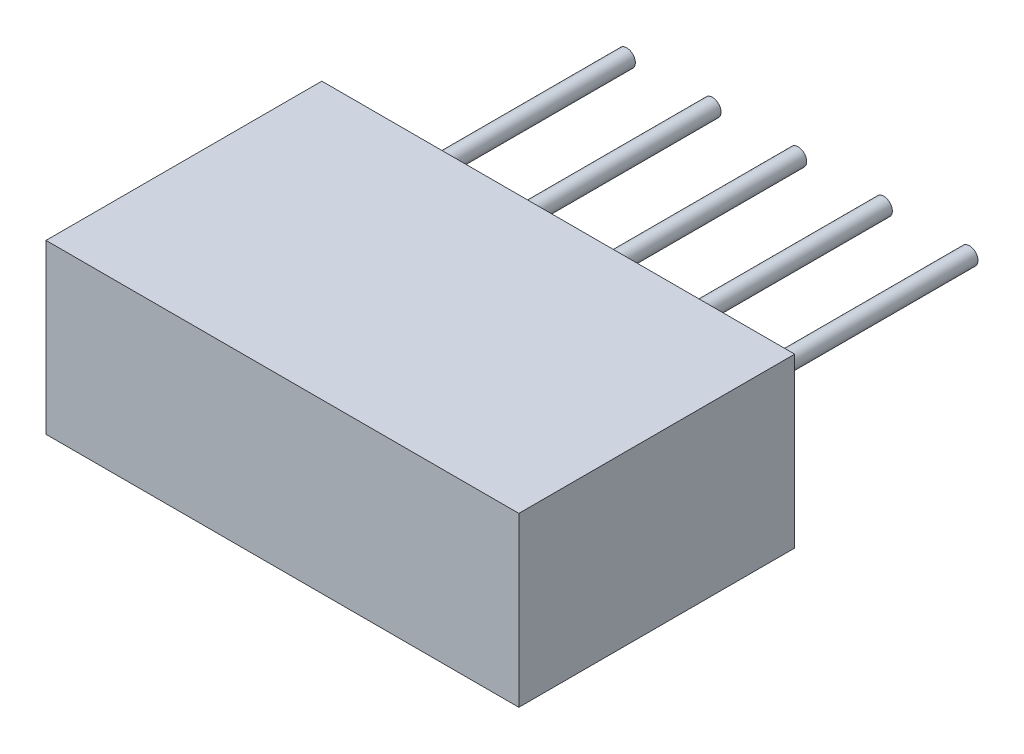
ISO-10303-21;
HEADER;
FILE_DESCRIPTION(('STEP AP214'),'2;1');
FILE_NAME('part.step','',(''),(''),'','','');
FILE_SCHEMA(('AUTOMOTIVE_DESIGN { 1 0 10303 214 1 1 1 1 }'));
ENDSEC;
DATA;
#1=APPLICATION_CONTEXT('core data for automotive mechanical design processes');
#2=APPLICATION_PROTOCOL_DEFINITION('international standard','automotive_design',2000,#1);
#3=PRODUCT_CONTEXT('',#1,'mechanical');
#4=PRODUCT('Part','Part','',(#3));
#5=PRODUCT_RELATED_PRODUCT_CATEGORY('part','',(#4));
#6=PRODUCT_DEFINITION_FORMATION('','',#4);
#7=PRODUCT_DEFINITION_CONTEXT('part definition',#1,'design');
#8=PRODUCT_DEFINITION('design','',#6,#7);
#9=PRODUCT_DEFINITION_SHAPE('','',#8);
#10=(LENGTH_UNIT() NAMED_UNIT(*) SI_UNIT(.MILLI.,.METRE.));
#11=(NAMED_UNIT(*) PLANE_ANGLE_UNIT() SI_UNIT($,.RADIAN.));
#12=(NAMED_UNIT(*) SI_UNIT($,.STERADIAN.) SOLID_ANGLE_UNIT());
#13=UNCERTAINTY_MEASURE_WITH_UNIT(LENGTH_MEASURE(1.E-05),#10,'distance_accuracy_value','');
#14=(GEOMETRIC_REPRESENTATION_CONTEXT(3) GLOBAL_UNCERTAINTY_ASSIGNED_CONTEXT((#13)) GLOBAL_UNIT_ASSIGNED_CONTEXT((#10,
#11,#12)) REPRESENTATION_CONTEXT('',''));
#15=CARTESIAN_POINT('',(0.,0.,0.));
#16=DIRECTION('',(0.,0.,1.));
#17=DIRECTION('',(1.,0.,0.));
#18=AXIS2_PLACEMENT_3D('',#15,#16,#17);
#19=CARTESIAN_POINT('',(0.,0.25,0.));
#20=DIRECTION('',(0.,0.,1.));
#21=DIRECTION('',(1.,0.,0.));
#22=AXIS2_PLACEMENT_3D('',#19,#20,#21);
#23=PLANE('',#22);
#24=CARTESIAN_POINT('',(0.,0.25,0.));
#25=DIRECTION('',(0.,0.,1.));
#26=DIRECTION('',(1.,0.,0.));
#27=AXIS2_PLACEMENT_3D('',#24,#25,#26);
#28=CIRCLE('',#27,0.127);
#29=CARTESIAN_POINT('',(-0.127,0.25,0.));
#30=VERTEX_POINT('',#29);
#31=EDGE_CURVE('P0_E18',#30,#30,#28,.T.);
#32=ORIENTED_EDGE('',*,*,#31,.T.);
#33=EDGE_LOOP('',(#32));
#34=FACE_BOUND('',#33,.T.);
#35=ADVANCED_FACE('P0_F15',(#34),#23,.T.);
#36=CARTESIAN_POINT('',(0.,0.25,-3.556));
#37=DIRECTION('',(0.,0.,1.));
#38=DIRECTION('',(1.,0.,0.));
#39=AXIS2_PLACEMENT_3D('',#36,#37,#38);
#40=PLANE('',#39);
#41=CARTESIAN_POINT('',(0.,0.25,-3.556));
#42=DIRECTION('',(0.,0.,-1.));
#43=DIRECTION('',(1.,0.,0.));
#44=AXIS2_PLACEMENT_3D('',#41,#42,#43);
#45=CIRCLE('',#44,0.127);
#46=CARTESIAN_POINT('',(-0.127,0.25,-3.556));
#47=VERTEX_POINT('',#46);
#48=EDGE_CURVE('P0_E10',#47,#47,#45,.T.);
#49=ORIENTED_EDGE('',*,*,#48,.T.);
#50=EDGE_LOOP('',(#49));
#51=FACE_BOUND('',#50,.T.);
#52=ADVANCED_FACE('P0_F50',(#51),#40,.F.);
#53=CARTESIAN_POINT('',(0.,0.25,-3.556));
#54=DIRECTION('',(0.,0.,1.));
#55=DIRECTION('',(1.,0.,0.));
#56=AXIS2_PLACEMENT_3D('',#53,#54,#55);
#57=CYLINDRICAL_SURFACE('',#56,0.127);
#58=ORIENTED_EDGE('',*,*,#48,.F.);
#59=EDGE_LOOP('',(#58));
#60=FACE_BOUND('',#59,.T.);
#61=ORIENTED_EDGE('',*,*,#31,.F.);
#62=EDGE_LOOP('',(#61));
#63=FACE_BOUND('',#62,.T.);
#64=ADVANCED_FACE('P0_F44',(#60,#63),#57,.T.);
#65=CLOSED_SHELL('',(#35,#52,#64));
#66=MANIFOLD_SOLID_BREP('P0_B1',#65);
#67=CARTESIAN_POINT('',(1.27,0.25,0.));
#68=DIRECTION('',(0.,0.,1.));
#69=DIRECTION('',(1.,0.,0.));
#70=AXIS2_PLACEMENT_3D('',#67,#68,#69);
#71=PLANE('',#70);
#72=CARTESIAN_POINT('',(1.27,0.25,0.));
#73=DIRECTION('',(0.,0.,1.));
#74=DIRECTION('',(1.,0.,0.));
#75=AXIS2_PLACEMENT_3D('',#72,#73,#74);
#76=CIRCLE('',#75,0.127);
#77=CARTESIAN_POINT('',(1.143,0.25,0.));
#78=VERTEX_POINT('',#77);
#79=EDGE_CURVE('P1_E25',#78,#78,#76,.T.);
#80=ORIENTED_EDGE('',*,*,#79,.T.);
#81=EDGE_LOOP('',(#80));
#82=FACE_BOUND('',#81,.T.);
#83=ADVANCED_FACE('P1_F16',(#82),#71,.T.);
#84=CARTESIAN_POINT('',(1.27,0.25,-3.556));
#85=DIRECTION('',(0.,0.,1.));
#86=DIRECTION('',(1.,0.,0.));
#87=AXIS2_PLACEMENT_3D('',#84,#85,#86);
#88=PLANE('',#87);
#89=CARTESIAN_POINT('',(1.27,0.25,-3.556));
#90=DIRECTION('',(0.,0.,-1.));
#91=DIRECTION('',(1.,0.,0.));
#92=AXIS2_PLACEMENT_3D('',#89,#90,#91);
#93=CIRCLE('',#92,0.127);
#94=CARTESIAN_POINT('',(1.143,0.25,-3.556));
#95=VERTEX_POINT('',#94);
#96=EDGE_CURVE('P1_E11',#95,#95,#93,.T.);
#97=ORIENTED_EDGE('',*,*,#96,.T.);
#98=EDGE_LOOP('',(#97));
#99=FACE_BOUND('',#98,.T.);
#100=ADVANCED_FACE('P1_F46',(#99),#88,.F.);
#101=CARTESIAN_POINT('',(1.27,0.25,-3.556));
#102=DIRECTION('',(0.,0.,1.));
#103=DIRECTION('',(1.,0.,0.));
#104=AXIS2_PLACEMENT_3D('',#101,#102,#103);
#105=CYLINDRICAL_SURFACE('',#104,0.127);
#106=ORIENTED_EDGE('',*,*,#96,.F.);
#107=EDGE_LOOP('',(#106));
#108=FACE_BOUND('',#107,.T.);
#109=ORIENTED_EDGE('',*,*,#79,.F.);
#110=EDGE_LOOP('',(#109));
#111=FACE_BOUND('',#110,.T.);
#112=ADVANCED_FACE('P1_F18',(#108,#111),#105,.T.);
#113=CLOSED_SHELL('',(#83,#100,#112));
#114=MANIFOLD_SOLID_BREP('P1_B1',#113);
#115=CARTESIAN_POINT('',(2.54,0.25,0.));
#116=DIRECTION('',(0.,0.,1.));
#117=DIRECTION('',(1.,0.,0.));
#118=AXIS2_PLACEMENT_3D('',#115,#116,#117);
#119=PLANE('',#118);
#120=CARTESIAN_POINT('',(2.54,0.25,0.));
#121=DIRECTION('',(0.,0.,1.));
#122=DIRECTION('',(1.,0.,0.));
#123=AXIS2_PLACEMENT_3D('',#120,#121,#122);
#124=CIRCLE('',#123,0.127);
#125=CARTESIAN_POINT('',(2.413,0.25,0.));
#126=VERTEX_POINT('',#125);
#127=EDGE_CURVE('P2_E29',#126,#126,#124,.T.);
#128=ORIENTED_EDGE('',*,*,#127,.T.);
#129=EDGE_LOOP('',(#128));
#130=FACE_BOUND('',#129,.T.);
#131=ADVANCED_FACE('P2_F19',(#130),#119,.T.);
#132=CARTESIAN_POINT('',(2.54,0.25,-3.556));
#133=DIRECTION('',(0.,0.,1.));
#134=DIRECTION('',(1.,0.,0.));
#135=AXIS2_PLACEMENT_3D('',#132,#133,#134);
#136=PLANE('',#135);
#137=CARTESIAN_POINT('',(2.54,0.25,-3.556));
#138=DIRECTION('',(0.,0.,-1.));
#139=DIRECTION('',(1.,0.,0.));
#140=AXIS2_PLACEMENT_3D('',#137,#138,#139);
#141=CIRCLE('',#140,0.127);
#142=CARTESIAN_POINT('',(2.413,0.25,-3.556));
#143=VERTEX_POINT('',#142);
#144=EDGE_CURVE('P2_E11',#143,#143,#141,.T.);
#145=ORIENTED_EDGE('',*,*,#144,.T.);
#146=EDGE_LOOP('',(#145));
#147=FACE_BOUND('',#146,.T.);
#148=ADVANCED_FACE('P2_F21',(#147),#136,.F.);
#149=CARTESIAN_POINT('',(2.54,0.25,-3.556));
#150=DIRECTION('',(0.,0.,1.));
#151=DIRECTION('',(1.,0.,0.));
#152=AXIS2_PLACEMENT_3D('',#149,#150,#151);
#153=CYLINDRICAL_SURFACE('',#152,0.127);
#154=ORIENTED_EDGE('',*,*,#144,.F.);
#155=EDGE_LOOP('',(#154));
#156=FACE_BOUND('',#155,.T.);
#157=ORIENTED_EDGE('',*,*,#127,.F.);
#158=EDGE_LOOP('',(#157));
#159=FACE_BOUND('',#158,.T.);
#160=ADVANCED_FACE('P2_F49',(#156,#159),#153,.T.);
#161=CLOSED_SHELL('',(#131,#148,#160));
#162=MANIFOLD_SOLID_BREP('P2_B1',#161);
#163=CARTESIAN_POINT('',(3.81,0.25,0.));
#164=DIRECTION('',(0.,0.,1.));
#165=DIRECTION('',(1.,0.,0.));
#166=AXIS2_PLACEMENT_3D('',#163,#164,#165);
#167=PLANE('',#166);
#168=CARTESIAN_POINT('',(3.81,0.25,0.));
#169=DIRECTION('',(0.,0.,1.));
#170=DIRECTION('',(1.,0.,0.));
#171=AXIS2_PLACEMENT_3D('',#168,#169,#170);
#172=CIRCLE('',#171,0.127);
#173=CARTESIAN_POINT('',(3.683,0.25,0.));
#174=VERTEX_POINT('',#173);
#175=EDGE_CURVE('P3_E24',#174,#174,#172,.T.);
#176=ORIENTED_EDGE('',*,*,#175,.T.);
#177=EDGE_LOOP('',(#176));
#178=FACE_BOUND('',#177,.T.);
#179=ADVANCED_FACE('P3_F16',(#178),#167,.T.);
#180=CARTESIAN_POINT('',(3.81,0.25,-3.556));
#181=DIRECTION('',(0.,0.,1.));
#182=DIRECTION('',(1.,0.,0.));
#183=AXIS2_PLACEMENT_3D('',#180,#181,#182);
#184=PLANE('',#183);
#185=CARTESIAN_POINT('',(3.81,0.25,-3.556));
#186=DIRECTION('',(0.,0.,-1.));
#187=DIRECTION('',(1.,0.,0.));
#188=AXIS2_PLACEMENT_3D('',#185,#186,#187);
#189=CIRCLE('',#188,0.127);
#190=CARTESIAN_POINT('',(3.683,0.25,-3.556));
#191=VERTEX_POINT('',#190);
#192=EDGE_CURVE('P3_E11',#191,#191,#189,.T.);
#193=ORIENTED_EDGE('',*,*,#192,.T.);
#194=EDGE_LOOP('',(#193));
#195=FACE_BOUND('',#194,.T.);
#196=ADVANCED_FACE('P3_F51',(#195),#184,.F.);
#197=CARTESIAN_POINT('',(3.81,0.25,-3.556));
#198=DIRECTION('',(0.,0.,1.));
#199=DIRECTION('',(1.,0.,0.));
#200=AXIS2_PLACEMENT_3D('',#197,#198,#199);
#201=CYLINDRICAL_SURFACE('',#200,0.127);
#202=ORIENTED_EDGE('',*,*,#192,.F.);
#203=EDGE_LOOP('',(#202));
#204=FACE_BOUND('',#203,.T.);
#205=ORIENTED_EDGE('',*,*,#175,.F.);
#206=EDGE_LOOP('',(#205));
#207=FACE_BOUND('',#206,.T.);
#208=ADVANCED_FACE('P3_F45',(#204,#207),#201,.T.);
#209=CLOSED_SHELL('',(#179,#196,#208));
#210=MANIFOLD_SOLID_BREP('P3_B1',#209);
#211=CARTESIAN_POINT('',(5.08,0.25,0.));
#212=DIRECTION('',(0.,0.,1.));
#213=DIRECTION('',(1.,0.,0.));
#214=AXIS2_PLACEMENT_3D('',#211,#212,#213);
#215=PLANE('',#214);
#216=CARTESIAN_POINT('',(5.08,0.25,0.));
#217=DIRECTION('',(0.,0.,1.));
#218=DIRECTION('',(1.,0.,0.));
#219=AXIS2_PLACEMENT_3D('',#216,#217,#218);
#220=CIRCLE('',#219,0.127);
#221=CARTESIAN_POINT('',(4.953,0.25,0.));
#222=VERTEX_POINT('',#221);
#223=EDGE_CURVE('P4_E26',#222,#222,#220,.T.);
#224=ORIENTED_EDGE('',*,*,#223,.T.);
#225=EDGE_LOOP('',(#224));
#226=FACE_BOUND('',#225,.T.);
#227=ADVANCED_FACE('P4_F16',(#226),#215,.T.);
#228=CARTESIAN_POINT('',(5.08,0.25,-3.556));
#229=DIRECTION('',(0.,0.,1.));
#230=DIRECTION('',(1.,0.,0.));
#231=AXIS2_PLACEMENT_3D('',#228,#229,#230);
#232=PLANE('',#231);
#233=CARTESIAN_POINT('',(5.08,0.25,-3.556));
#234=DIRECTION('',(0.,0.,-1.));
#235=DIRECTION('',(1.,0.,0.));
#236=AXIS2_PLACEMENT_3D('',#233,#234,#235);
#237=CIRCLE('',#236,0.127);
#238=CARTESIAN_POINT('',(4.953,0.25,-3.556));
#239=VERTEX_POINT('',#238);
#240=EDGE_CURVE('P4_E11',#239,#239,#237,.T.);
#241=ORIENTED_EDGE('',*,*,#240,.T.);
#242=EDGE_LOOP('',(#241));
#243=FACE_BOUND('',#242,.T.);
#244=ADVANCED_FACE('P4_F18',(#243),#232,.F.);
#245=CARTESIAN_POINT('',(5.08,0.25,-3.556));
#246=DIRECTION('',(0.,0.,1.));
#247=DIRECTION('',(1.,0.,0.));
#248=AXIS2_PLACEMENT_3D('',#245,#246,#247);
#249=CYLINDRICAL_SURFACE('',#248,0.127);
#250=ORIENTED_EDGE('',*,*,#240,.F.);
#251=EDGE_LOOP('',(#250));
#252=FACE_BOUND('',#251,.T.);
#253=ORIENTED_EDGE('',*,*,#223,.F.);
#254=EDGE_LOOP('',(#253));
#255=FACE_BOUND('',#254,.T.);
#256=ADVANCED_FACE('P4_F46',(#252,#255),#249,.T.);
#257=CLOSED_SHELL('',(#227,#244,#256));
#258=MANIFOLD_SOLID_BREP('P4_B1',#257);
#259=CARTESIAN_POINT('',(-0.965,-1.245,4.089));
#260=DIRECTION('',(0.,0.,1.));
#261=DIRECTION('',(1.,0.,0.));
#262=AXIS2_PLACEMENT_3D('',#259,#260,#261);
#263=PLANE('',#262);
#264=DIRECTION('',(1.,0.,0.));
#265=VECTOR('',#264,1.);
#266=CARTESIAN_POINT('',(-0.965,-1.245,4.089));
#267=LINE('',#266,#265);
#268=CARTESIAN_POINT('',(-0.965,-1.245,4.089));
#269=VERTEX_POINT('',#268);
#270=CARTESIAN_POINT('',(6.045,-1.245,4.089));
#271=VERTEX_POINT('',#270);
#272=EDGE_CURVE('P5_E87',#269,#271,#267,.T.);
#273=ORIENTED_EDGE('',*,*,#272,.T.);
#274=DIRECTION('',(0.,1.,0.));
#275=VECTOR('',#274,1.);
#276=CARTESIAN_POINT('',(6.045,-1.245,4.089));
#277=LINE('',#276,#275);
#278=CARTESIAN_POINT('',(6.045,1.245,4.089));
#279=VERTEX_POINT('',#278);
#280=EDGE_CURVE('P5_E107',#271,#279,#277,.T.);
#281=ORIENTED_EDGE('',*,*,#280,.T.);
#282=DIRECTION('',(-1.,0.,0.));
#283=VECTOR('',#282,1.);
#284=CARTESIAN_POINT('',(6.045,1.245,4.089));
#285=LINE('',#284,#283);
#286=CARTESIAN_POINT('',(-0.965,1.245,4.089));
#287=VERTEX_POINT('',#286);
#288=EDGE_CURVE('P5_E79',#279,#287,#285,.T.);
#289=ORIENTED_EDGE('',*,*,#288,.T.);
#290=DIRECTION('',(0.,-1.,0.));
#291=VECTOR('',#290,1.);
#292=CARTESIAN_POINT('',(-0.965,1.245,4.089));
#293=LINE('',#292,#291);
#294=EDGE_CURVE('P5_E11',#287,#269,#293,.T.);
#295=ORIENTED_EDGE('',*,*,#294,.T.);
#296=EDGE_LOOP('',(#273,#281,#289,#295));
#297=FACE_BOUND('',#296,.T.);
#298=ADVANCED_FACE('P5_F18',(#297),#263,.T.);
#299=CARTESIAN_POINT('',(-0.965,1.245,0.));
#300=DIRECTION('',(0.,0.,-1.));
#301=DIRECTION('',(0.,-1.,0.));
#302=AXIS2_PLACEMENT_3D('',#299,#300,#301);
#303=PLANE('',#302);
#304=DIRECTION('',(1.,0.,0.));
#305=VECTOR('',#304,1.);
#306=CARTESIAN_POINT('',(-0.965,1.245,0.));
#307=LINE('',#306,#305);
#308=CARTESIAN_POINT('',(-0.965,1.245,0.));
#309=VERTEX_POINT('',#308);
#310=CARTESIAN_POINT('',(6.045,1.245,0.));
#311=VERTEX_POINT('',#310);
#312=EDGE_CURVE('P5_E105',#309,#311,#307,.T.);
#313=ORIENTED_EDGE('',*,*,#312,.T.);
#314=DIRECTION('',(0.,-1.,0.));
#315=VECTOR('',#314,1.);
#316=CARTESIAN_POINT('',(6.045,1.245,0.));
#317=LINE('',#316,#315);
#318=CARTESIAN_POINT('',(6.045,-1.245,0.));
#319=VERTEX_POINT('',#318);
#320=EDGE_CURVE('P5_E66',#311,#319,#317,.T.);
#321=ORIENTED_EDGE('',*,*,#320,.T.);
#322=DIRECTION('',(-1.,0.,0.));
#323=VECTOR('',#322,1.);
#324=CARTESIAN_POINT('',(6.045,-1.245,0.));
#325=LINE('',#324,#323);
#326=CARTESIAN_POINT('',(-0.965,-1.245,0.));
#327=VERTEX_POINT('',#326);
#328=EDGE_CURVE('P5_E85',#319,#327,#325,.T.);
#329=ORIENTED_EDGE('',*,*,#328,.T.);
#330=DIRECTION('',(0.,1.,0.));
#331=VECTOR('',#330,1.);
#332=CARTESIAN_POINT('',(-0.965,-1.245,0.));
#333=LINE('',#332,#331);
#334=EDGE_CURVE('P5_E29',#327,#309,#333,.T.);
#335=ORIENTED_EDGE('',*,*,#334,.T.);
#336=EDGE_LOOP('',(#313,#321,#329,#335));
#337=FACE_BOUND('',#336,.T.);
#338=ADVANCED_FACE('P5_F89',(#337),#303,.T.);
#339=CARTESIAN_POINT('',(-0.965,1.245,0.));
#340=DIRECTION('',(-1.,0.,0.));
#341=DIRECTION('',(0.,0.,1.));
#342=AXIS2_PLACEMENT_3D('',#339,#340,#341);
#343=PLANE('',#342);
#344=ORIENTED_EDGE('',*,*,#334,.F.);
#345=DIRECTION('',(0.,0.,1.));
#346=VECTOR('',#345,1.);
#347=CARTESIAN_POINT('',(-0.965,-1.245,0.));
#348=LINE('',#347,#346);
#349=EDGE_CURVE('P5_E22',#327,#269,#348,.T.);
#350=ORIENTED_EDGE('',*,*,#349,.T.);
#351=ORIENTED_EDGE('',*,*,#294,.F.);
#352=DIRECTION('',(0.,0.,-1.));
#353=VECTOR('',#352,1.);
#354=CARTESIAN_POINT('',(-0.965,1.245,4.089));
#355=LINE('',#354,#353);
#356=EDGE_CURVE('P5_E76',#287,#309,#355,.T.);
#357=ORIENTED_EDGE('',*,*,#356,.T.);
#358=EDGE_LOOP('',(#344,#350,#351,#357));
#359=FACE_BOUND('',#358,.T.);
#360=ADVANCED_FACE('P5_F73',(#359),#343,.T.);
#361=CARTESIAN_POINT('',(6.045,1.245,0.));
#362=DIRECTION('',(0.,1.,0.));
#363=DIRECTION('',(1.,0.,0.));
#364=AXIS2_PLACEMENT_3D('',#361,#362,#363);
#365=PLANE('',#364);
#366=ORIENTED_EDGE('',*,*,#312,.F.);
#367=ORIENTED_EDGE('',*,*,#356,.F.);
#368=ORIENTED_EDGE('',*,*,#288,.F.);
#369=DIRECTION('',(0.,0.,-1.));
#370=VECTOR('',#369,1.);
#371=CARTESIAN_POINT('',(6.045,1.245,4.089));
#372=LINE('',#371,#370);
#373=EDGE_CURVE('P5_E100',#279,#311,#372,.T.);
#374=ORIENTED_EDGE('',*,*,#373,.T.);
#375=EDGE_LOOP('',(#366,#367,#368,#374));
#376=FACE_BOUND('',#375,.T.);
#377=ADVANCED_FACE('P5_F20',(#376),#365,.T.);
#378=CARTESIAN_POINT('',(6.045,-1.245,0.));
#379=DIRECTION('',(1.,0.,0.));
#380=DIRECTION('',(0.,1.,0.));
#381=AXIS2_PLACEMENT_3D('',#378,#379,#380);
#382=PLANE('',#381);
#383=ORIENTED_EDGE('',*,*,#320,.F.);
#384=ORIENTED_EDGE('',*,*,#373,.F.);
#385=ORIENTED_EDGE('',*,*,#280,.F.);
#386=DIRECTION('',(0.,0.,-1.));
#387=VECTOR('',#386,1.);
#388=CARTESIAN_POINT('',(6.045,-1.245,4.089));
#389=LINE('',#388,#387);
#390=EDGE_CURVE('P5_E91',#271,#319,#389,.T.);
#391=ORIENTED_EDGE('',*,*,#390,.T.);
#392=EDGE_LOOP('',(#383,#384,#385,#391));
#393=FACE_BOUND('',#392,.T.);
#394=ADVANCED_FACE('P5_F156',(#393),#382,.T.);
#395=CARTESIAN_POINT('',(-0.965,-1.245,0.));
#396=DIRECTION('',(0.,-1.,0.));
#397=DIRECTION('',(0.,0.,-1.));
#398=AXIS2_PLACEMENT_3D('',#395,#396,#397);
#399=PLANE('',#398);
#400=ORIENTED_EDGE('',*,*,#328,.F.);
#401=ORIENTED_EDGE('',*,*,#390,.F.);
#402=ORIENTED_EDGE('',*,*,#272,.F.);
#403=ORIENTED_EDGE('',*,*,#349,.F.);
#404=EDGE_LOOP('',(#400,#401,#402,#403));
#405=FACE_BOUND('',#404,.T.);
#406=ADVANCED_FACE('P5_F83',(#405),#399,.T.);
#407=CLOSED_SHELL('',(#298,#338,#360,#377,#394,#406));
#408=MANIFOLD_SOLID_BREP('P5_B1',#407);
#409=ADVANCED_BREP_SHAPE_REPRESENTATION('',(#18,#66,#114,#162,#210,#258,#408),#14);
#410=SHAPE_DEFINITION_REPRESENTATION(#9,#409);
ENDSEC;
END-ISO-10303-21;
